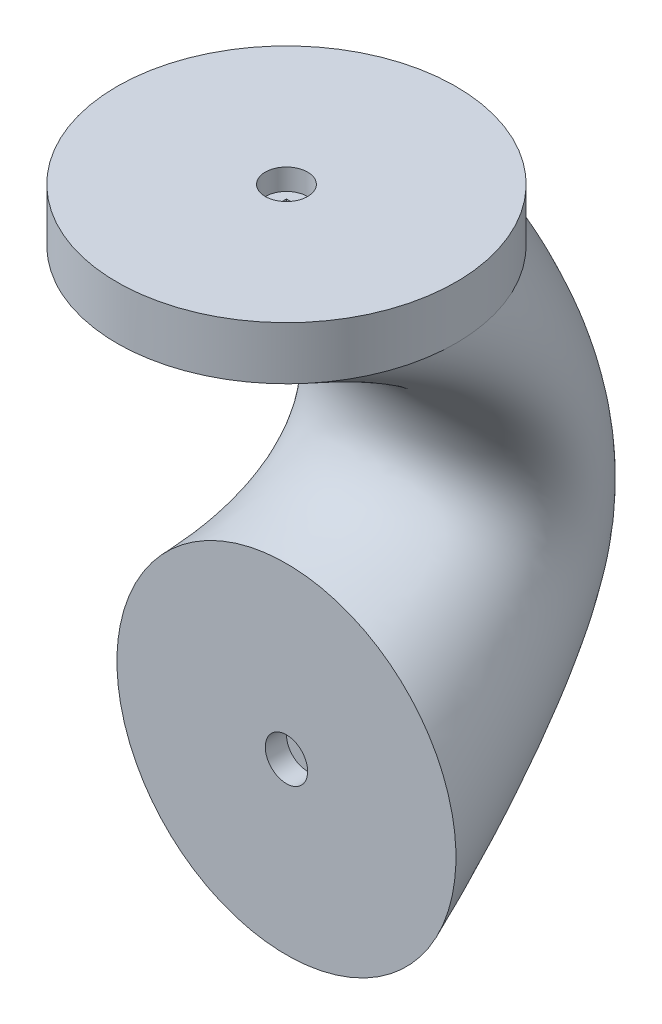
ISO-10303-21;
HEADER;
FILE_DESCRIPTION(('STEP AP214'),'2;1');
FILE_NAME('part.step','',(''),(''),'','','');
FILE_SCHEMA(('AUTOMOTIVE_DESIGN { 1 0 10303 214 1 1 1 1 }'));
ENDSEC;
DATA;
#1=APPLICATION_CONTEXT('core data for automotive mechanical design processes');
#2=APPLICATION_PROTOCOL_DEFINITION('international standard','automotive_design',2000,#1);
#3=PRODUCT_CONTEXT('',#1,'mechanical');
#4=PRODUCT('Part','Part','',(#3));
#5=PRODUCT_RELATED_PRODUCT_CATEGORY('part','',(#4));
#6=PRODUCT_DEFINITION_FORMATION('','',#4);
#7=PRODUCT_DEFINITION_CONTEXT('part definition',#1,'design');
#8=PRODUCT_DEFINITION('design','',#6,#7);
#9=PRODUCT_DEFINITION_SHAPE('','',#8);
#10=(LENGTH_UNIT() NAMED_UNIT(*) SI_UNIT(.MILLI.,.METRE.));
#11=(NAMED_UNIT(*) PLANE_ANGLE_UNIT() SI_UNIT($,.RADIAN.));
#12=(NAMED_UNIT(*) SI_UNIT($,.STERADIAN.) SOLID_ANGLE_UNIT());
#13=UNCERTAINTY_MEASURE_WITH_UNIT(LENGTH_MEASURE(1.E-05),#10,'distance_accuracy_value','');
#14=(GEOMETRIC_REPRESENTATION_CONTEXT(3) GLOBAL_UNCERTAINTY_ASSIGNED_CONTEXT((#13)) GLOBAL_UNIT_ASSIGNED_CONTEXT((#10,
#11,#12)) REPRESENTATION_CONTEXT('',''));
#15=CARTESIAN_POINT('',(0.,0.,0.));
#16=DIRECTION('',(0.,0.,1.));
#17=DIRECTION('',(1.,0.,0.));
#18=AXIS2_PLACEMENT_3D('',#15,#16,#17);
#19=CARTESIAN_POINT('',(0.,225.,-2.35228503342455E-12));
#20=DIRECTION('',(0.,1.,0.));
#21=DIRECTION('',(-1.,0.,0.));
#22=AXIS2_PLACEMENT_3D('',#19,#20,#21);
#23=PLANE('',#22);
#24=CARTESIAN_POINT('',(0.,225.,-2.35228503342455E-12));
#25=DIRECTION('',(0.,1.,0.));
#26=DIRECTION('',(-1.,0.,0.));
#27=AXIS2_PLACEMENT_3D('',#24,#25,#26);
#28=CIRCLE('',#27,10.);
#29=CARTESIAN_POINT('',(-10.,225.,-2.35228503342455E-12));
#30=VERTEX_POINT('',#29);
#31=EDGE_CURVE('E190',#30,#30,#28,.T.);
#32=ORIENTED_EDGE('',*,*,#31,.T.);
#33=EDGE_LOOP('',(#32));
#34=FACE_BOUND('',#33,.T.);
#35=DIRECTION('',(1.,0.,0.));
#36=VECTOR('',#35,1.);
#37=CARTESIAN_POINT('',(0.,224.999999999999,-4.));
#38=LINE('',#37,#36);
#39=CARTESIAN_POINT('',(-4.,224.999999999999,-4.));
#40=VERTEX_POINT('',#39);
#41=CARTESIAN_POINT('',(4.,224.999999999999,-4.));
#42=VERTEX_POINT('',#41);
#43=EDGE_CURVE('E176',#40,#42,#38,.T.);
#44=ORIENTED_EDGE('',*,*,#43,.T.);
#45=DIRECTION('',(0.,0.,1.));
#46=VECTOR('',#45,1.);
#47=CARTESIAN_POINT('',(4.,225.,-2.35271871429354E-12));
#48=LINE('',#47,#46);
#49=CARTESIAN_POINT('',(4.,225.,4.));
#50=VERTEX_POINT('',#49);
#51=EDGE_CURVE('E170',#42,#50,#48,.T.);
#52=ORIENTED_EDGE('',*,*,#51,.T.);
#53=DIRECTION('',(-1.,0.,0.));
#54=VECTOR('',#53,1.);
#55=CARTESIAN_POINT('',(0.,225.,4.));
#56=LINE('',#55,#54);
#57=CARTESIAN_POINT('',(-4.,225.,4.));
#58=VERTEX_POINT('',#57);
#59=EDGE_CURVE('E171',#50,#58,#56,.T.);
#60=ORIENTED_EDGE('',*,*,#59,.T.);
#61=DIRECTION('',(0.,0.,-1.));
#62=VECTOR('',#61,1.);
#63=CARTESIAN_POINT('',(-4.,225.,-2.35141767168656E-12));
#64=LINE('',#63,#62);
#65=EDGE_CURVE('E111',#58,#40,#64,.T.);
#66=ORIENTED_EDGE('',*,*,#65,.T.);
#67=EDGE_LOOP('',(#44,#52,#60,#66));
#68=FACE_BOUND('',#67,.T.);
#69=ADVANCED_FACE('F95',(#34,#68),#23,.T.);
#70=CARTESIAN_POINT('',(0.,-4.46733336276805E-13,0.));
#71=DIRECTION('',(0.,0.,1.));
#72=DIRECTION('',(0.,-1.,0.));
#73=AXIS2_PLACEMENT_3D('',#70,#71,#72);
#74=PLANE('',#73);
#75=CARTESIAN_POINT('',(0.,-4.46733336276805E-13,0.));
#76=DIRECTION('',(0.,0.,1.));
#77=DIRECTION('',(0.,-1.,0.));
#78=AXIS2_PLACEMENT_3D('',#75,#76,#77);
#79=CIRCLE('',#78,10.);
#80=CARTESIAN_POINT('',(0.,-10.0000000000005,1.11683334069201E-13));
#81=VERTEX_POINT('',#80);
#82=EDGE_CURVE('E244',#81,#81,#79,.T.);
#83=ORIENTED_EDGE('',*,*,#82,.F.);
#84=EDGE_LOOP('',(#83));
#85=FACE_BOUND('',#84,.T.);
#86=CARTESIAN_POINT('',(-78.4955339615384,15.4418634915919,-1.56125112837913E-13));
#87=CARTESIAN_POINT('',(-78.2907679151548,16.4827495321157,-1.66533453693773E-13));
#88=CARTESIAN_POINT('',(-77.8407206554618,18.5521313295571,-1.87350135405495E-13));
#89=CARTESIAN_POINT('',(-77.0461181703535,21.6160053611403,-2.22044604925031E-13));
#90=CARTESIAN_POINT('',(-76.1339979948852,24.6366529143849,-2.4980018054066E-13));
#91=CARTESIAN_POINT('',(-69.9682542311678,42.4830124812616,-4.37150315946155E-13));
#92=CARTESIAN_POINT('',(-58.6786225704238,56.9641528622484,-5.89805981832114E-13));
#93=CARTESIAN_POINT('',(-26.9694972149722,78.2482931009689,-8.11850586757146E-13));
#94=CARTESIAN_POINT('',(-5.37585731888476,82.5908548892098,-8.60422844084496E-13));
#95=CARTESIAN_POINT('',(36.2595843020694,74.400213033866,-7.70217223333702E-13));
#96=CARTESIAN_POINT('',(54.59924839128,62.201858721029,-6.45317133063372E-13));
#97=CARTESIAN_POINT('',(78.2482931009694,26.9694972149717,-2.77555756156289E-13));
#98=CARTESIAN_POINT('',(82.5908548892102,5.37585731888426,0.));
#99=CARTESIAN_POINT('',(74.4002130338665,-36.2595843020699,3.88578058618805E-13));
#100=CARTESIAN_POINT('',(62.2018587210295,-54.5992483912805,5.759281940243E-13));
#101=CARTESIAN_POINT('',(26.9694972149722,-78.2482931009698,8.2572837456496E-13));
#102=CARTESIAN_POINT('',(5.37585731888471,-82.5908548892107,8.74300631892311E-13));
#103=CARTESIAN_POINT('',(-36.2595843020695,-74.400213033867,7.84095011141517E-13));
#104=CARTESIAN_POINT('',(-54.59924839128,-62.2018587210299,6.59194920871187E-13));
#105=CARTESIAN_POINT('',(-75.8833886300005,-30.4927333655783,3.2612801348364E-13));
#106=CARTESIAN_POINT('',(-80.8464994463279,-12.814307508224,1.38777878078145E-13));
#107=CARTESIAN_POINT('',(-79.7928337689043,6.03771452099855,0.));
#108=CARTESIAN_POINT('',(-79.4928054067643,9.17877450726598,0.));
#109=CARTESIAN_POINT('',(-79.0676426871096,12.3153257745923,-1.2490009027033E-13));
#110=CARTESIAN_POINT('',(-78.700300007922,14.400977451068,-1.45716771982052E-13));
#111=CARTESIAN_POINT('',(-78.4955339615384,15.4418634915919,-1.56125112837913E-13));
#112=B_SPLINE_CURVE_WITH_KNOTS('',3,(#86,#87,#88,#89,#90,#91,#92,#93,#94,#95,#96,#97,#98,#99,
#100,#101,#102,#103,#104,#105,#106,#107,#108,#109,#110,#111),.UNSPECIFIED.,.T.,.F.,(4,1,1,1,1,2,
2,2,2,2,2,2,1,1,1,1,4),(0.,0.00624999999999998,0.0125,0.01875,0.025,0.125,0.25,0.375,0.5,0.625,
0.75,0.875,0.975,0.98125,0.9875,0.99375,1.),.UNSPECIFIED.);
#113=CARTESIAN_POINT('',(-78.4955339615384,15.4418634915919,-1.56125112837913E-13));
#114=VERTEX_POINT('',#113);
#115=EDGE_CURVE('E13',#114,#114,#112,.F.);
#116=ORIENTED_EDGE('',*,*,#115,.T.);
#117=EDGE_LOOP('',(#116));
#118=FACE_BOUND('',#117,.T.);
#119=ADVANCED_FACE('F216',(#85,#118),#74,.T.);
#120=CARTESIAN_POINT('',(-4.26953224874579,210.,79.8859880978921));
#121=CARTESIAN_POINT('',(-7.34343946329563,190.937433940464,12.8035084154866));
#122=CARTESIAN_POINT('',(-23.8165774564036,136.700170021841,-69.0081449852945));
#123=CARTESIAN_POINT('',(-56.8274406051574,61.2320096015246,-40.4538169831083));
#124=CARTESIAN_POINT('',(-78.4955339615384,15.4418634915919,-1.56125112837913E-13));
#125=CARTESIAN_POINT('',(-5.32885633570974,210.,79.8293721823999));
#126=CARTESIAN_POINT('',(-8.34136297329252,190.883252717362,12.5627547807266));
#127=CARTESIAN_POINT('',(-24.5260193105289,136.594371930209,-69.3461713435527));
#128=CARTESIAN_POINT('',(-57.2553238636545,60.4834964405713,-40.6568044871041));
#129=CARTESIAN_POINT('',(-78.700300007922,14.400977451068,-1.45716771982052E-13));
#130=CARTESIAN_POINT('',(-7.44092455179814,210.,79.6742870118389));
#131=CARTESIAN_POINT('',(-10.3274748854592,190.761080006735,12.0466123955619));
#132=CARTESIAN_POINT('',(-25.9305895102461,136.360642971833,-70.0399849657436));
#133=CARTESIAN_POINT('',(-58.0787839195589,58.9714926856448,-41.0695935735287));
#134=CARTESIAN_POINT('',(-79.0676426871096,12.3153257745923,-1.2490009027033E-13));
#135=CARTESIAN_POINT('',(-10.5860064546738,210.,79.3176681467263));
#136=CARTESIAN_POINT('',(-13.2751453085567,190.537662231989,11.1735464326661));
#137=CARTESIAN_POINT('',(-27.9945023466145,135.947181886347,-71.1356188696489));
#138=CARTESIAN_POINT('',(-59.212940976331,56.6567728676174,-41.7048810816127));
#139=CARTESIAN_POINT('',(-79.4928054067643,9.17877450726598,0.));
#140=CARTESIAN_POINT('',(-13.7047873885539,210.,78.8386270818009));
#141=CARTESIAN_POINT('',(-16.187639842738,190.273976340561,10.2030874495868));
#142=CARTESIAN_POINT('',(-30.0134866003312,135.471735299098,-72.2838661235894));
#143=CARTESIAN_POINT('',(-60.2464550202236,54.29921333557,-42.3560543112377));
#144=CARTESIAN_POINT('',(-79.7928337689043,6.03771452099855,0.));
#145=CARTESIAN_POINT('',(-32.2399838914289,210.,75.2392609501215));
#146=CARTESIAN_POINT('',(-33.435610196774,188.4594426383,3.81047549071135));
#147=CARTESIAN_POINT('',(-41.8484395099821,132.251474406079,-79.483251825148));
#148=CARTESIAN_POINT('',(-65.8369655747833,39.9142797321368,-46.3474851615091));
#149=CARTESIAN_POINT('',(-80.8464994463279,-12.814307508224,1.38777878078145E-13));
#150=CARTESIAN_POINT('',(-48.162591149811,210.,66.0943285903697));
#151=CARTESIAN_POINT('',(-47.6460515466437,184.723964255188,-6.69285586211083));
#152=CARTESIAN_POINT('',(-50.724370944086,126.432351181825,-88.6596427463479));
#153=CARTESIAN_POINT('',(-66.2362794437871,24.4786587526829,-50.8134401766238));
#154=CARTESIAN_POINT('',(-75.8833886300005,-30.4927333655783,3.2612801348364E-13));
#155=CARTESIAN_POINT('',(-73.6873740633674,210.,37.687133837542));
#156=CARTESIAN_POINT('',(-69.2431002992718,174.910405375223,-34.4295819405119));
#157=CARTESIAN_POINT('',(-62.2212305936391,109.341818944477,-110.861182683762));
#158=CARTESIAN_POINT('',(-56.3805628799422,-6.66147969864688,-59.482214597706));
#159=CARTESIAN_POINT('',(-54.59924839128,-62.2018587210299,6.59194920871187E-13));
#160=CARTESIAN_POINT('',(-81.0183064077394,210.,16.9169494905308));
#161=CARTESIAN_POINT('',(-74.1822559844138,168.136807338666,-52.3640348664452));
#162=CARTESIAN_POINT('',(-62.7966144724955,97.4916431755918,-123.896946270221));
#163=CARTESIAN_POINT('',(-44.4405097294273,-21.4468428488322,-63.7506017194784));
#164=CARTESIAN_POINT('',(-36.2595843020695,-74.400213033867,7.84095011141517E-13));
#165=CARTESIAN_POINT('',(-78.7536697880493,209.999999999999,-25.4560139880265));
#166=CARTESIAN_POINT('',(-69.2668770629814,156.408598160343,-86.5073850129935));
#167=CARTESIAN_POINT('',(-51.3059404745315,73.1879429803417,-145.079076763309));
#168=CARTESIAN_POINT('',(-13.0831238428986,-38.6684636008768,-69.4281084949621));
#169=CARTESIAN_POINT('',(5.37585731888471,-82.5908548892107,8.74300631892311E-13));
#170=CARTESIAN_POINT('',(-69.2506835629082,209.999999999999,-45.326504159418));
#171=CARTESIAN_POINT('',(-59.5049251953282,151.453987018577,-100.983993273454));
#172=CARTESIAN_POINT('',(-39.5153942279425,62.148756244797,-152.372528921162));
#173=CARTESIAN_POINT('',(4.63207125745905,-40.7698718719885,-70.8372281486734));
#174=CARTESIAN_POINT('',(26.9694972149722,-78.2482931009698,8.2572837456496E-13));
#175=CARTESIAN_POINT('',(-37.6871338375441,209.999999999999,-73.6873740633696));
#176=CARTESIAN_POINT('',(-29.7985042731117,145.57849302701,-119.621657886473));
#177=CARTESIAN_POINT('',(-9.24767147613107,46.9883913702784,-156.466505798452));
#178=CARTESIAN_POINT('',(36.8039481650703,-30.7626757439231,-70.4258375293941));
#179=CARTESIAN_POINT('',(62.2018587210295,-54.5992483912805,5.759281940243E-13));
#180=CARTESIAN_POINT('',(-16.9169494905329,209.999999999999,-81.0183064077416));
#181=CARTESIAN_POINT('',(-11.1444143717603,144.65761017721,-122.623266850844));
#182=CARTESIAN_POINT('',(8.09702240621196,43.911933400952,-153.282295716753));
#183=CARTESIAN_POINT('',(49.8202626751911,-19.620890176984,-68.6053272564035));
#184=CARTESIAN_POINT('',(74.4002130338665,-36.2595843020699,3.88578058618805E-13));
#185=CARTESIAN_POINT('',(25.4560139880244,209.999999999999,-78.7536697880514));
#186=CARTESIAN_POINT('',(26.5118398559727,148.374788279581,-115.584642754263));
#187=CARTESIAN_POINT('',(38.8490081020253,46.4671618212813,-137.138591427869));
#188=CARTESIAN_POINT('',(64.5151650927447,12.064137311653,-63.0879315515078));
#189=CARTESIAN_POINT('',(82.5908548892102,5.37585731888426,0.));
#190=CARTESIAN_POINT('',(45.3265041594159,209.999999999999,-69.2506835629104));
#191=CARTESIAN_POINT('',(43.7817152221998,153.012849231754,-105.636992432233));
#192=CARTESIAN_POINT('',(50.9302392612991,52.1619679529168,-125.053600220727));
#193=CARTESIAN_POINT('',(65.8589036694298,30.9052415976949,-59.3910461196027));
#194=CARTESIAN_POINT('',(78.2482931009694,26.9694972149717,-2.77555756156289E-13));
#195=CARTESIAN_POINT('',(73.6873740633674,209.999999999999,-37.6871338375462));
#196=CARTESIAN_POINT('',(70.040055496663,163.704210629771,-74.8173262342407));
#197=CARTESIAN_POINT('',(61.4120962354018,71.385292708879,-100.378615276172));
#198=CARTESIAN_POINT('',(57.1853092290769,65.2593888878315,-49.7713942799008));
#199=CARTESIAN_POINT('',(54.59924839128,62.201858721029,-6.45317133063372E-13));
#200=CARTESIAN_POINT('',(81.0183064077394,209.999999999999,-16.916949490535));
#201=CARTESIAN_POINT('',(77.8690730167113,169.757511075615,-55.2356895114901));
#202=CARTESIAN_POINT('',(59.0698717114161,83.9583559587196,-89.0100903428917));
#203=CARTESIAN_POINT('',(48.1347950442769,79.3320645947935,-43.848627872104));
#204=CARTESIAN_POINT('',(36.2595843020694,74.400213033866,-7.70217223333702E-13));
#205=CARTESIAN_POINT('',(78.7536697880492,210.,25.4560139880223));
#206=CARTESIAN_POINT('',(75.0895507540866,179.816270522377,-18.5962040986979));
#207=CARTESIAN_POINT('',(45.4312781915232,109.937189599899,-70.3476530722292));
#208=CARTESIAN_POINT('',(18.8983292514516,94.9024289519168,-35.6759754030766));
#209=CARTESIAN_POINT('',(-5.37585731888476,82.5908548892098,-8.60422844084496E-13));
#210=CARTESIAN_POINT('',(69.2506835629081,210.,45.3265041594138));
#211=CARTESIAN_POINT('',(64.5735937103349,183.821729523294,-3.27064436881091));
#212=CARTESIAN_POINT('',(34.4104208258474,121.928622300418,-63.906655483624));
#213=CARTESIAN_POINT('',(0.414515279082568,96.0652682713306,-33.4260893418461));
#214=CARTESIAN_POINT('',(-26.9694972149722,78.2482931009689,-8.11850586757146E-13));
#215=CARTESIAN_POINT('',(40.8434888100803,210.,70.8512870729701));
#216=CARTESIAN_POINT('',(35.9005236225508,189.374447226232,13.5227992072267));
#217=CARTESIAN_POINT('',(9.10265084895997,135.325970004623,-60.2507867579819));
#218=CARTESIAN_POINT('',(-30.4377176343195,87.2881411231514,-33.7611717480134));
#219=CARTESIAN_POINT('',(-58.6786225704238,56.9641528622484,-5.89805981832114E-13));
#220=CARTESIAN_POINT('',(24.0368617274568,210.,78.2469950089789));
#221=CARTESIAN_POINT('',(19.5567226618698,191.370545153104,16.5874214065678));
#222=CARTESIAN_POINT('',(-4.1446824391769,137.849131601484,-61.5127963662102));
#223=CARTESIAN_POINT('',(-43.11367234745,79.6942891159195,-35.5759143148923));
#224=CARTESIAN_POINT('',(-69.9682542311678,42.4830124812616,-4.37150315946155E-13));
#225=CARTESIAN_POINT('',(5.22360886715598,210.,79.8502612889381));
#226=CARTESIAN_POINT('',(1.63989275889863,191.245926490713,14.5067633635901));
#227=CARTESIAN_POINT('',(-17.3366615802015,137.362601871885,-66.2459365526234));
#228=CARTESIAN_POINT('',(-52.5984917479122,67.6702880744328,-38.7267920818864));
#229=CARTESIAN_POINT('',(-76.1339979948852,24.6366529143849,-2.4980018054066E-13));
#230=CARTESIAN_POINT('',(2.07153501068136,210.,79.9941545088896));
#231=CARTESIAN_POINT('',(-1.35263785896672,191.186528597058,14.0521903706473));
#232=CARTESIAN_POINT('',(-19.5184400630412,137.2125656838,-67.0987634517506));
#233=CARTESIAN_POINT('',(-54.0977840238306,65.5972657447514,-39.2772356272543));
#234=CARTESIAN_POINT('',(-77.0461181703535,21.6160053611403,-2.22044604925031E-13));
#235=CARTESIAN_POINT('',(-1.09364147481536,210.,80.0135195910978));
#236=CARTESIAN_POINT('',(-4.34859527027869,191.086167345345,13.4906712904272));
#237=CARTESIAN_POINT('',(-21.6805686887652,136.995747120336,-68.0161993311946));
#238=CARTESIAN_POINT('',(-55.5131586152305,63.4540609631866,-39.8516685495536));
#239=CARTESIAN_POINT('',(-77.8407206554618,18.5521313295571,-1.87350135405495E-13));
#240=CARTESIAN_POINT('',(-3.21020816178187,210.,79.9426040133844));
#241=CARTESIAN_POINT('',(-6.34551595329876,190.991615163565,13.0442620502466));
#242=CARTESIAN_POINT('',(-23.1071356022783,136.805968113473,-68.6701186270363));
#243=CARTESIAN_POINT('',(-56.3995573466604,61.9805227624779,-40.2508294791124));
#244=CARTESIAN_POINT('',(-78.2907679151548,16.4827495321157,-1.66533453693773E-13));
#245=CARTESIAN_POINT('',(-4.26953224874579,210.,79.8859880978921));
#246=CARTESIAN_POINT('',(-7.34343946329563,190.937433940464,12.8035084154866));
#247=CARTESIAN_POINT('',(-23.8165774564036,136.700170021841,-69.0081449852945));
#248=CARTESIAN_POINT('',(-56.8274406051574,61.2320096015246,-40.4538169831083));
#249=CARTESIAN_POINT('',(-78.4955339615384,15.4418634915919,-1.56125112837913E-13));
#250=B_SPLINE_SURFACE_WITH_KNOTS('',3,3,((#120,#121,#122,#123,#124),(#125,#126,#127,#128,#129),
(#130,#131,#132,#133,#134),(#135,#136,#137,#138,#139),(#140,#141,#142,#143,#144),(#145,#146,
#147,#148,#149),(#150,#151,#152,#153,#154),(#155,#156,#157,#158,#159),(#160,#161,#162,#163,
#164),(#165,#166,#167,#168,#169),(#170,#171,#172,#173,#174),(#175,#176,#177,#178,#179),(#180,
#181,#182,#183,#184),(#185,#186,#187,#188,#189),(#190,#191,#192,#193,#194),(#195,#196,#197,#198,
#199),(#200,#201,#202,#203,#204),(#205,#206,#207,#208,#209),(#210,#211,#212,#213,#214),(#215,
#216,#217,#218,#219),(#220,#221,#222,#223,#224),(#225,#226,#227,#228,#229),(#230,#231,#232,#233,
#234),(#235,#236,#237,#238,#239),(#240,#241,#242,#243,#244),(#245,#246,#247,#248,#249)),
.UNSPECIFIED.,.T.,.F.,.F.,(4,1,1,1,1,2,2,2,2,2,2,2,1,1,1,1,4),(4,1,4),(0.,0.00625000000000009,
0.0125,0.01875,0.0249999999999999,0.125,0.25,0.375,0.5,0.625,0.75,0.875,0.975,0.98125,0.9875,
0.99375,1.),(0.,0.53467536756128,1.),.UNSPECIFIED.);
#251=CARTESIAN_POINT('',(-4.26953224874579,210.,79.8859880978921));
#252=CARTESIAN_POINT('',(-5.32885633570974,210.,79.8293721823999));
#253=CARTESIAN_POINT('',(-7.44092455179814,210.,79.6742870118389));
#254=CARTESIAN_POINT('',(-10.5860064546738,210.,79.3176681467263));
#255=CARTESIAN_POINT('',(-13.7047873885539,210.,78.8386270818009));
#256=CARTESIAN_POINT('',(-32.2399838914289,210.,75.2392609501215));
#257=CARTESIAN_POINT('',(-48.162591149811,210.,66.0943285903697));
#258=CARTESIAN_POINT('',(-73.6873740633674,210.,37.687133837542));
#259=CARTESIAN_POINT('',(-81.0183064077394,210.,16.9169494905308));
#260=CARTESIAN_POINT('',(-78.7536697880493,209.999999999999,-25.4560139880265));
#261=CARTESIAN_POINT('',(-69.2506835629082,209.999999999999,-45.326504159418));
#262=CARTESIAN_POINT('',(-37.6871338375441,209.999999999999,-73.6873740633696));
#263=CARTESIAN_POINT('',(-16.9169494905329,209.999999999999,-81.0183064077416));
#264=CARTESIAN_POINT('',(25.4560139880244,209.999999999999,-78.7536697880514));
#265=CARTESIAN_POINT('',(45.3265041594159,209.999999999999,-69.2506835629104));
#266=CARTESIAN_POINT('',(73.6873740633674,209.999999999999,-37.6871338375462));
#267=CARTESIAN_POINT('',(81.0183064077394,209.999999999999,-16.916949490535));
#268=CARTESIAN_POINT('',(78.7536697880492,210.,25.4560139880223));
#269=CARTESIAN_POINT('',(69.2506835629081,210.,45.3265041594138));
#270=CARTESIAN_POINT('',(40.8434888100803,210.,70.8512870729701));
#271=CARTESIAN_POINT('',(24.0368617274568,210.,78.2469950089789));
#272=CARTESIAN_POINT('',(5.22360886715598,210.,79.8502612889381));
#273=CARTESIAN_POINT('',(2.07153501068136,210.,79.9941545088896));
#274=CARTESIAN_POINT('',(-1.09364147481536,210.,80.0135195910978));
#275=CARTESIAN_POINT('',(-3.21020816178187,210.,79.9426040133844));
#276=CARTESIAN_POINT('',(-4.26953224874579,210.,79.8859880978921));
#277=B_SPLINE_CURVE_WITH_KNOTS('',3,(#251,#252,#253,#254,#255,#256,#257,#258,#259,#260,#261,
#262,#263,#264,#265,#266,#267,#268,#269,#270,#271,#272,#273,#274,#275,#276),.UNSPECIFIED.,.T.,
.F.,(4,1,1,1,1,2,2,2,2,2,2,2,1,1,1,1,4),(0.,0.00625000000000009,0.0125,0.01875,
0.0249999999999999,0.125,0.25,0.375,0.5,0.625,0.75,0.875,0.975,0.98125,0.9875,0.99375,1.),.UNSPECIFIED.);
#278=CARTESIAN_POINT('',(-4.26953224874579,210.,79.8859880978921));
#279=VERTEX_POINT('',#278);
#280=EDGE_CURVE('E192',#279,#279,#277,.T.);
#281=ORIENTED_EDGE('',*,*,#280,.T.);
#282=EDGE_LOOP('',(#281));
#283=FACE_BOUND('',#282,.T.);
#284=ORIENTED_EDGE('',*,*,#115,.F.);
#285=EDGE_LOOP('',(#284));
#286=FACE_BOUND('',#285,.T.);
#287=ADVANCED_FACE('F203',(#283,#286),#250,.T.);
#288=CARTESIAN_POINT('',(0.,-5.51477776442099E-13,-9.99999999999999));
#289=DIRECTION('',(0.,0.,1.));
#290=DIRECTION('',(0.,-1.,0.));
#291=AXIS2_PLACEMENT_3D('',#288,#289,#290);
#292=CYLINDRICAL_SURFACE('',#291,10.);
#293=CARTESIAN_POINT('',(0.,-5.51477776442099E-13,-9.99999999999999));
#294=DIRECTION('',(0.,0.,1.));
#295=DIRECTION('',(0.,-1.,0.));
#296=AXIS2_PLACEMENT_3D('',#293,#294,#295);
#297=CIRCLE('',#296,10.);
#298=CARTESIAN_POINT('',(0.,-10.0000000000006,-9.99999999999989));
#299=VERTEX_POINT('',#298);
#300=EDGE_CURVE('E248',#299,#299,#297,.T.);
#301=ORIENTED_EDGE('',*,*,#300,.F.);
#302=EDGE_LOOP('',(#301));
#303=FACE_BOUND('',#302,.T.);
#304=ORIENTED_EDGE('',*,*,#82,.T.);
#305=EDGE_LOOP('',(#304));
#306=FACE_BOUND('',#305,.T.);
#307=ADVANCED_FACE('F219',(#303,#306),#292,.F.);
#308=CARTESIAN_POINT('',(0.,-5.51477776442099E-13,-9.99999999999999));
#309=DIRECTION('',(0.,0.,1.));
#310=DIRECTION('',(0.,-1.,0.));
#311=AXIS2_PLACEMENT_3D('',#308,#309,#310);
#312=PLANE('',#311);
#313=ORIENTED_EDGE('',*,*,#300,.T.);
#314=EDGE_LOOP('',(#313));
#315=FACE_BOUND('',#314,.T.);
#316=ADVANCED_FACE('F351',(#315),#312,.T.);
#317=CARTESIAN_POINT('',(0.,235.,-2.45636844198316E-12));
#318=DIRECTION('',(0.,-1.,0.));
#319=DIRECTION('',(1.,0.,0.));
#320=AXIS2_PLACEMENT_3D('',#317,#318,#319);
#321=CYLINDRICAL_SURFACE('',#320,80.);
#322=CARTESIAN_POINT('',(0.,235.,-2.45636844198316E-12));
#323=DIRECTION('',(0.,1.,0.));
#324=DIRECTION('',(-1.,0.,0.));
#325=AXIS2_PLACEMENT_3D('',#322,#323,#324);
#326=CIRCLE('',#325,80.);
#327=CARTESIAN_POINT('',(-80.,235.,-2.45636844198316E-12));
#328=VERTEX_POINT('',#327);
#329=EDGE_CURVE('E236',#328,#328,#326,.T.);
#330=ORIENTED_EDGE('',*,*,#329,.F.);
#331=EDGE_LOOP('',(#330));
#332=FACE_BOUND('',#331,.T.);
#333=ORIENTED_EDGE('',*,*,#280,.F.);
#334=EDGE_LOOP('',(#333));
#335=FACE_BOUND('',#334,.T.);
#336=ADVANCED_FACE('F217',(#332,#335),#321,.T.);
#337=CARTESIAN_POINT('',(0.,235.,-2.45636844198316E-12));
#338=DIRECTION('',(0.,1.,0.));
#339=DIRECTION('',(-1.,0.,0.));
#340=AXIS2_PLACEMENT_3D('',#337,#338,#339);
#341=PLANE('',#340);
#342=CARTESIAN_POINT('',(0.,235.,-2.45636844198316E-12));
#343=DIRECTION('',(0.,1.,0.));
#344=DIRECTION('',(-1.,0.,0.));
#345=AXIS2_PLACEMENT_3D('',#342,#343,#344);
#346=CIRCLE('',#345,10.);
#347=CARTESIAN_POINT('',(-10.,235.,-2.45636844198316E-12));
#348=VERTEX_POINT('',#347);
#349=EDGE_CURVE('E187',#348,#348,#346,.T.);
#350=ORIENTED_EDGE('',*,*,#349,.F.);
#351=EDGE_LOOP('',(#350));
#352=FACE_BOUND('',#351,.T.);
#353=ORIENTED_EDGE('',*,*,#329,.T.);
#354=EDGE_LOOP('',(#353));
#355=FACE_BOUND('',#354,.T.);
#356=ADVANCED_FACE('F354',(#352,#355),#341,.T.);
#357=CARTESIAN_POINT('',(0.,225.,-2.35228503342455E-12));
#358=DIRECTION('',(0.,1.,0.));
#359=DIRECTION('',(-1.,0.,0.));
#360=AXIS2_PLACEMENT_3D('',#357,#358,#359);
#361=CYLINDRICAL_SURFACE('',#360,10.);
#362=ORIENTED_EDGE('',*,*,#31,.F.);
#363=EDGE_LOOP('',(#362));
#364=FACE_BOUND('',#363,.T.);
#365=ORIENTED_EDGE('',*,*,#349,.T.);
#366=EDGE_LOOP('',(#365));
#367=FACE_BOUND('',#366,.T.);
#368=ADVANCED_FACE('F220',(#364,#367),#361,.F.);
#369=CARTESIAN_POINT('',(4.,215.,-2.35271871429354E-12));
#370=DIRECTION('',(-1.,0.,0.));
#371=DIRECTION('',(0.,0.,1.));
#372=AXIS2_PLACEMENT_3D('',#369,#370,#371);
#373=PLANE('',#372);
#374=ORIENTED_EDGE('',*,*,#51,.F.);
#375=DIRECTION('',(0.,1.,0.));
#376=VECTOR('',#375,1.);
#377=CARTESIAN_POINT('',(4.,214.999999999999,-4.));
#378=LINE('',#377,#376);
#379=CARTESIAN_POINT('',(4.,214.999999999999,-4.));
#380=VERTEX_POINT('',#379);
#381=EDGE_CURVE('E133',#380,#42,#378,.T.);
#382=ORIENTED_EDGE('',*,*,#381,.F.);
#383=DIRECTION('',(0.,0.,1.));
#384=VECTOR('',#383,1.);
#385=CARTESIAN_POINT('',(4.,215.,-2.35271871429354E-12));
#386=LINE('',#385,#384);
#387=CARTESIAN_POINT('',(4.,215.,4.));
#388=VERTEX_POINT('',#387);
#389=EDGE_CURVE('E155',#380,#388,#386,.T.);
#390=ORIENTED_EDGE('',*,*,#389,.T.);
#391=DIRECTION('',(0.,1.,0.));
#392=VECTOR('',#391,1.);
#393=CARTESIAN_POINT('',(4.,215.,4.));
#394=LINE('',#393,#392);
#395=EDGE_CURVE('E148',#388,#50,#394,.T.);
#396=ORIENTED_EDGE('',*,*,#395,.T.);
#397=EDGE_LOOP('',(#374,#382,#390,#396));
#398=FACE_BOUND('',#397,.T.);
#399=ADVANCED_FACE('F270',(#398),#373,.T.);
#400=CARTESIAN_POINT('',(0.,215.,4.));
#401=DIRECTION('',(0.,0.,-1.));
#402=DIRECTION('',(-1.,0.,0.));
#403=AXIS2_PLACEMENT_3D('',#400,#401,#402);
#404=PLANE('',#403);
#405=ORIENTED_EDGE('',*,*,#59,.F.);
#406=ORIENTED_EDGE('',*,*,#395,.F.);
#407=DIRECTION('',(-1.,0.,0.));
#408=VECTOR('',#407,1.);
#409=CARTESIAN_POINT('',(0.,215.,4.));
#410=LINE('',#409,#408);
#411=CARTESIAN_POINT('',(-4.,215.,4.));
#412=VERTEX_POINT('',#411);
#413=EDGE_CURVE('E145',#388,#412,#410,.T.);
#414=ORIENTED_EDGE('',*,*,#413,.T.);
#415=DIRECTION('',(0.,1.,0.));
#416=VECTOR('',#415,1.);
#417=CARTESIAN_POINT('',(-4.,215.,4.));
#418=LINE('',#417,#416);
#419=EDGE_CURVE('E149',#412,#58,#418,.T.);
#420=ORIENTED_EDGE('',*,*,#419,.T.);
#421=EDGE_LOOP('',(#405,#406,#414,#420));
#422=FACE_BOUND('',#421,.T.);
#423=ADVANCED_FACE('F147',(#422),#404,.T.);
#424=CARTESIAN_POINT('',(-4.,215.,-2.35141767168656E-12));
#425=DIRECTION('',(1.,0.,0.));
#426=DIRECTION('',(0.,0.,-1.));
#427=AXIS2_PLACEMENT_3D('',#424,#425,#426);
#428=PLANE('',#427);
#429=ORIENTED_EDGE('',*,*,#65,.F.);
#430=ORIENTED_EDGE('',*,*,#419,.F.);
#431=DIRECTION('',(0.,0.,-1.));
#432=VECTOR('',#431,1.);
#433=CARTESIAN_POINT('',(-4.,215.,-2.35141767168656E-12));
#434=LINE('',#433,#432);
#435=CARTESIAN_POINT('',(-4.,214.999999999999,-4.));
#436=VERTEX_POINT('',#435);
#437=EDGE_CURVE('E151',#412,#436,#434,.T.);
#438=ORIENTED_EDGE('',*,*,#437,.T.);
#439=DIRECTION('',(0.,1.,0.));
#440=VECTOR('',#439,1.);
#441=CARTESIAN_POINT('',(-4.,214.999999999999,-4.));
#442=LINE('',#441,#440);
#443=EDGE_CURVE('E156',#436,#40,#442,.T.);
#444=ORIENTED_EDGE('',*,*,#443,.T.);
#445=EDGE_LOOP('',(#429,#430,#438,#444));
#446=FACE_BOUND('',#445,.T.);
#447=ADVANCED_FACE('F152',(#446),#428,.T.);
#448=CARTESIAN_POINT('',(0.,214.999999999999,-4.));
#449=DIRECTION('',(0.,0.,1.));
#450=DIRECTION('',(1.,0.,0.));
#451=AXIS2_PLACEMENT_3D('',#448,#449,#450);
#452=PLANE('',#451);
#453=ORIENTED_EDGE('',*,*,#43,.F.);
#454=ORIENTED_EDGE('',*,*,#443,.F.);
#455=DIRECTION('',(1.,0.,0.));
#456=VECTOR('',#455,1.);
#457=CARTESIAN_POINT('',(0.,214.999999999999,-4.));
#458=LINE('',#457,#456);
#459=EDGE_CURVE('E119',#436,#380,#458,.T.);
#460=ORIENTED_EDGE('',*,*,#459,.T.);
#461=ORIENTED_EDGE('',*,*,#381,.T.);
#462=EDGE_LOOP('',(#453,#454,#460,#461));
#463=FACE_BOUND('',#462,.T.);
#464=ADVANCED_FACE('F267',(#463),#452,.T.);
#465=CARTESIAN_POINT('',(0.,215.,-2.35674990371911E-12));
#466=DIRECTION('',(0.,-1.,0.));
#467=DIRECTION('',(0.,0.,-1.));
#468=AXIS2_PLACEMENT_3D('',#465,#466,#467);
#469=PLANE('',#468);
#470=ORIENTED_EDGE('',*,*,#389,.F.);
#471=ORIENTED_EDGE('',*,*,#459,.F.);
#472=ORIENTED_EDGE('',*,*,#437,.F.);
#473=ORIENTED_EDGE('',*,*,#413,.F.);
#474=EDGE_LOOP('',(#470,#471,#472,#473));
#475=FACE_BOUND('',#474,.T.);
#476=ADVANCED_FACE('F158',(#475),#469,.F.);
#477=CLOSED_SHELL('',(#69,#119,#287,#307,#316,#336,#356,#368,#399,#423,#447,#464,#476));
#478=CARTESIAN_POINT('',(0.,200.,-2.08860706507608E-12));
#479=DIRECTION('',(0.,1.,0.));
#480=DIRECTION('',(-1.,0.,0.));
#481=AXIS2_PLACEMENT_3D('',#478,#479,#480);
#482=PLANE('',#481);
#483=CARTESIAN_POINT('',(0.,200.,-2.08860706507608E-12));
#484=DIRECTION('',(0.,1.,0.));
#485=DIRECTION('',(-1.,0.,0.));
#486=AXIS2_PLACEMENT_3D('',#483,#484,#485);
#487=CIRCLE('',#486,10.);
#488=CARTESIAN_POINT('',(-10.,200.,-2.08860706507608E-12));
#489=VERTEX_POINT('',#488);
#490=EDGE_CURVE('E104',#489,#489,#487,.T.);
#491=ORIENTED_EDGE('',*,*,#490,.T.);
#492=EDGE_LOOP('',(#491));
#493=FACE_BOUND('',#492,.T.);
#494=ADVANCED_FACE('F253',(#493),#482,.T.);
#495=CARTESIAN_POINT('',(0.,200.,-2.08860706507608E-12));
#496=DIRECTION('',(0.,1.,0.));
#497=DIRECTION('',(-1.,0.,0.));
#498=AXIS2_PLACEMENT_3D('',#495,#496,#497);
#499=CYLINDRICAL_SURFACE('',#498,10.);
#500=ORIENTED_EDGE('',*,*,#490,.F.);
#501=EDGE_LOOP('',(#500));
#502=FACE_BOUND('',#501,.T.);
#503=CARTESIAN_POINT('',(0.,210.,-2.19269047363468E-12));
#504=DIRECTION('',(0.,1.,0.));
#505=DIRECTION('',(-1.,0.,0.));
#506=AXIS2_PLACEMENT_3D('',#503,#504,#505);
#507=CIRCLE('',#506,10.);
#508=CARTESIAN_POINT('',(-10.,210.,-2.19269047363468E-12));
#509=VERTEX_POINT('',#508);
#510=EDGE_CURVE('E97',#509,#509,#507,.T.);
#511=ORIENTED_EDGE('',*,*,#510,.T.);
#512=EDGE_LOOP('',(#511));
#513=FACE_BOUND('',#512,.T.);
#514=ADVANCED_FACE('F259',(#502,#513),#499,.F.);
#515=CARTESIAN_POINT('',(0.,210.,-2.19269047363468E-12));
#516=DIRECTION('',(0.,1.,0.));
#517=DIRECTION('',(-1.,0.,0.));
#518=AXIS2_PLACEMENT_3D('',#515,#516,#517);
#519=PLANE('',#518);
#520=ORIENTED_EDGE('',*,*,#510,.F.);
#521=EDGE_LOOP('',(#520));
#522=FACE_BOUND('',#521,.T.);
#523=ADVANCED_FACE('F92',(#522),#519,.F.);
#524=CLOSED_SHELL('',(#494,#514,#523));
#525=ORIENTED_CLOSED_SHELL('',*,#524,.T.);
#526=BREP_WITH_VOIDS('B2',#477,(#525));
#527=ADVANCED_BREP_SHAPE_REPRESENTATION('',(#18,#526),#14);
#528=SHAPE_DEFINITION_REPRESENTATION(#9,#527);
ENDSEC;
END-ISO-10303-21;
